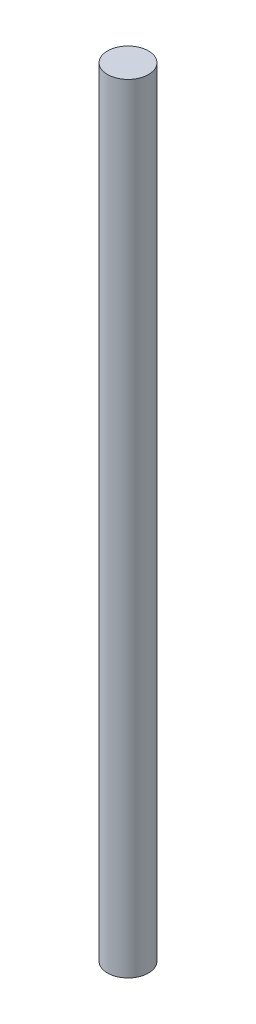
ISO-10303-21;
HEADER;
FILE_DESCRIPTION(('STEP AP214'),'2;1');
FILE_NAME('part.step','',(''),(''),'','','');
FILE_SCHEMA(('AUTOMOTIVE_DESIGN { 1 0 10303 214 1 1 1 1 }'));
ENDSEC;
DATA;
#1=APPLICATION_CONTEXT('core data for automotive mechanical design processes');
#2=APPLICATION_PROTOCOL_DEFINITION('international standard','automotive_design',2000,#1);
#3=PRODUCT_CONTEXT('',#1,'mechanical');
#4=PRODUCT('Part','Part','',(#3));
#5=PRODUCT_RELATED_PRODUCT_CATEGORY('part','',(#4));
#6=PRODUCT_DEFINITION_FORMATION('','',#4);
#7=PRODUCT_DEFINITION_CONTEXT('part definition',#1,'design');
#8=PRODUCT_DEFINITION('design','',#6,#7);
#9=PRODUCT_DEFINITION_SHAPE('','',#8);
#10=(LENGTH_UNIT() NAMED_UNIT(*) SI_UNIT(.MILLI.,.METRE.));
#11=(NAMED_UNIT(*) PLANE_ANGLE_UNIT() SI_UNIT($,.RADIAN.));
#12=(NAMED_UNIT(*) SI_UNIT($,.STERADIAN.) SOLID_ANGLE_UNIT());
#13=UNCERTAINTY_MEASURE_WITH_UNIT(LENGTH_MEASURE(1.E-05),#10,'distance_accuracy_value','');
#14=(GEOMETRIC_REPRESENTATION_CONTEXT(3) GLOBAL_UNCERTAINTY_ASSIGNED_CONTEXT((#13)) GLOBAL_UNIT_ASSIGNED_CONTEXT((#10,
#11,#12)) REPRESENTATION_CONTEXT('',''));
#15=CARTESIAN_POINT('',(0.,0.,0.));
#16=DIRECTION('',(0.,0.,1.));
#17=DIRECTION('',(1.,0.,0.));
#18=AXIS2_PLACEMENT_3D('',#15,#16,#17);
#19=CARTESIAN_POINT('',(-10.5,76.,0.));
#20=DIRECTION('',(0.,-1.,0.));
#21=DIRECTION('',(0.,0.,-1.));
#22=AXIS2_PLACEMENT_3D('',#19,#20,#21);
#23=PLANE('',#22);
#24=CARTESIAN_POINT('',(0.,76.,0.));
#25=DIRECTION('',(0.,1.,0.));
#26=DIRECTION('',(0.,0.,-1.));
#27=AXIS2_PLACEMENT_3D('',#24,#25,#26);
#28=CIRCLE('',#27,2.);
#29=CARTESIAN_POINT('',(0.,76.,-2.));
#30=VERTEX_POINT('',#29);
#31=EDGE_CURVE('E11',#30,#30,#28,.T.);
#32=ORIENTED_EDGE('',*,*,#31,.T.);
#33=EDGE_LOOP('',(#32));
#34=FACE_BOUND('',#33,.T.);
#35=ADVANCED_FACE('F17',(#34),#23,.F.);
#36=CARTESIAN_POINT('',(-10.5,0.,0.));
#37=DIRECTION('',(0.,-1.,0.));
#38=DIRECTION('',(0.,0.,-1.));
#39=AXIS2_PLACEMENT_3D('',#36,#37,#38);
#40=PLANE('',#39);
#41=CARTESIAN_POINT('',(0.,0.,0.));
#42=DIRECTION('',(0.,-1.,0.));
#43=DIRECTION('',(0.,0.,-1.));
#44=AXIS2_PLACEMENT_3D('',#41,#42,#43);
#45=CIRCLE('',#44,2.);
#46=CARTESIAN_POINT('',(0.,0.,-2.));
#47=VERTEX_POINT('',#46);
#48=EDGE_CURVE('E27',#47,#47,#45,.T.);
#49=ORIENTED_EDGE('',*,*,#48,.T.);
#50=EDGE_LOOP('',(#49));
#51=FACE_BOUND('',#50,.T.);
#52=ADVANCED_FACE('F19',(#51),#40,.T.);
#53=CARTESIAN_POINT('',(0.,76.002,0.));
#54=DIRECTION('',(0.,-1.,0.));
#55=DIRECTION('',(0.,0.,-1.));
#56=AXIS2_PLACEMENT_3D('',#53,#54,#55);
#57=CYLINDRICAL_SURFACE('',#56,2.);
#58=ORIENTED_EDGE('',*,*,#31,.F.);
#59=EDGE_LOOP('',(#58));
#60=FACE_BOUND('',#59,.T.);
#61=ORIENTED_EDGE('',*,*,#48,.F.);
#62=EDGE_LOOP('',(#61));
#63=FACE_BOUND('',#62,.T.);
#64=ADVANCED_FACE('F40',(#60,#63),#57,.T.);
#65=CLOSED_SHELL('',(#35,#52,#64));
#66=MANIFOLD_SOLID_BREP('B1',#65);
#67=ADVANCED_BREP_SHAPE_REPRESENTATION('',(#18,#66),#14);
#68=SHAPE_DEFINITION_REPRESENTATION(#9,#67);
ENDSEC;
END-ISO-10303-21;
